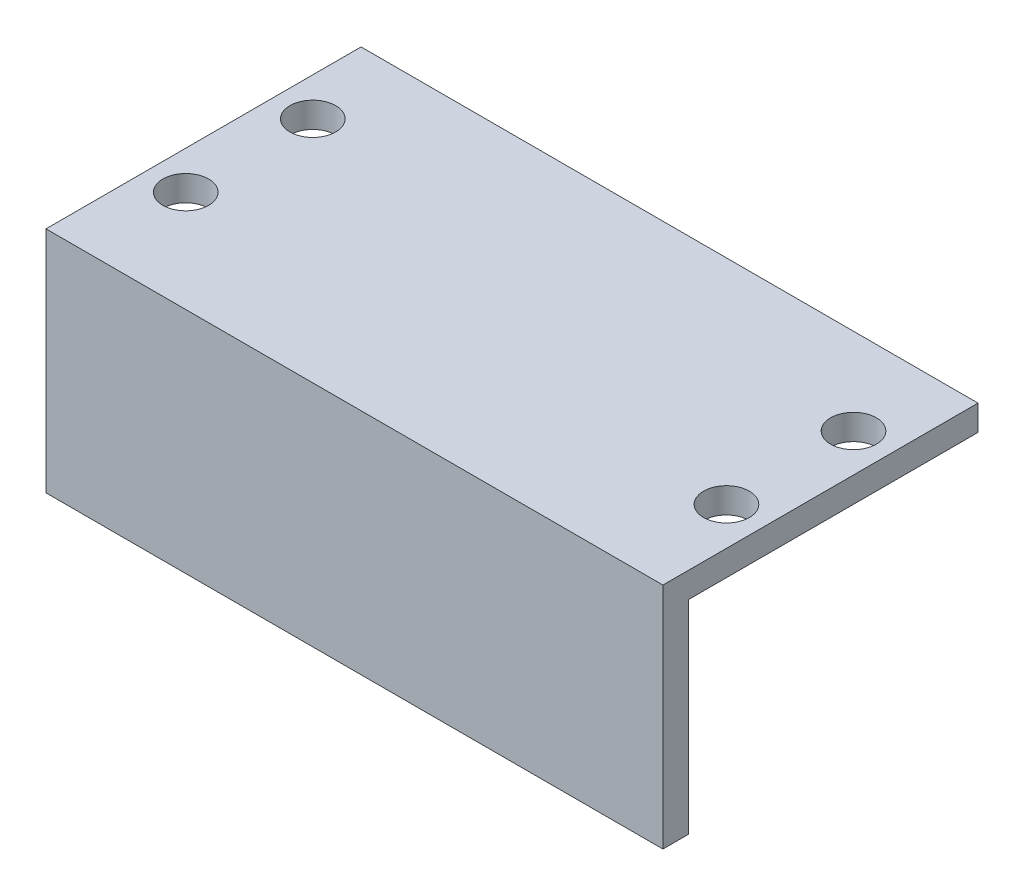
ISO-10303-21;
HEADER;
FILE_DESCRIPTION(('STEP AP214'),'2;1');
FILE_NAME('part.step','',(''),(''),'','','');
FILE_SCHEMA(('AUTOMOTIVE_DESIGN { 1 0 10303 214 1 1 1 1 }'));
ENDSEC;
DATA;
#1=APPLICATION_CONTEXT('core data for automotive mechanical design processes');
#2=APPLICATION_PROTOCOL_DEFINITION('international standard','automotive_design',2000,#1);
#3=PRODUCT_CONTEXT('',#1,'mechanical');
#4=PRODUCT('Part','Part','',(#3));
#5=PRODUCT_RELATED_PRODUCT_CATEGORY('part','',(#4));
#6=PRODUCT_DEFINITION_FORMATION('','',#4);
#7=PRODUCT_DEFINITION_CONTEXT('part definition',#1,'design');
#8=PRODUCT_DEFINITION('design','',#6,#7);
#9=PRODUCT_DEFINITION_SHAPE('','',#8);
#10=(LENGTH_UNIT() NAMED_UNIT(*) SI_UNIT(.MILLI.,.METRE.));
#11=(NAMED_UNIT(*) PLANE_ANGLE_UNIT() SI_UNIT($,.RADIAN.));
#12=(NAMED_UNIT(*) SI_UNIT($,.STERADIAN.) SOLID_ANGLE_UNIT());
#13=UNCERTAINTY_MEASURE_WITH_UNIT(LENGTH_MEASURE(1.E-05),#10,'distance_accuracy_value','');
#14=(GEOMETRIC_REPRESENTATION_CONTEXT(3) GLOBAL_UNCERTAINTY_ASSIGNED_CONTEXT((#13)) GLOBAL_UNIT_ASSIGNED_CONTEXT((#10,
#11,#12)) REPRESENTATION_CONTEXT('',''));
#15=CARTESIAN_POINT('',(0.,0.,0.));
#16=DIRECTION('',(0.,0.,1.));
#17=DIRECTION('',(1.,0.,0.));
#18=AXIS2_PLACEMENT_3D('',#15,#16,#17);
#19=CARTESIAN_POINT('',(24.28,1.,0.));
#20=DIRECTION('',(-1.,0.,0.));
#21=DIRECTION('',(0.,0.,1.));
#22=AXIS2_PLACEMENT_3D('',#19,#20,#21);
#23=PLANE('',#22);
#24=DIRECTION('',(0.,0.,-1.));
#25=VECTOR('',#24,1.);
#26=CARTESIAN_POINT('',(24.28,0.,0.));
#27=LINE('',#26,#25);
#28=CARTESIAN_POINT('',(24.28,0.,0.));
#29=VERTEX_POINT('',#28);
#30=CARTESIAN_POINT('',(24.28,0.,-11.4));
#31=VERTEX_POINT('',#30);
#32=EDGE_CURVE('E76',#29,#31,#27,.T.);
#33=ORIENTED_EDGE('',*,*,#32,.T.);
#34=DIRECTION('',(0.,-1.,0.));
#35=VECTOR('',#34,1.);
#36=CARTESIAN_POINT('',(24.28,1.,-11.4));
#37=LINE('',#36,#35);
#38=CARTESIAN_POINT('',(24.28,1.,-11.4));
#39=VERTEX_POINT('',#38);
#40=EDGE_CURVE('E11',#39,#31,#37,.T.);
#41=ORIENTED_EDGE('',*,*,#40,.F.);
#42=DIRECTION('',(0.,0.,-1.));
#43=VECTOR('',#42,1.);
#44=CARTESIAN_POINT('',(24.28,1.,0.));
#45=LINE('',#44,#43);
#46=CARTESIAN_POINT('',(24.28,1.,1.));
#47=VERTEX_POINT('',#46);
#48=EDGE_CURVE('E105',#47,#39,#45,.T.);
#49=ORIENTED_EDGE('',*,*,#48,.F.);
#50=DIRECTION('',(0.,1.,0.));
#51=VECTOR('',#50,1.);
#52=CARTESIAN_POINT('',(24.28,-8.,1.));
#53=LINE('',#52,#51);
#54=CARTESIAN_POINT('',(24.28,-8.,1.));
#55=VERTEX_POINT('',#54);
#56=EDGE_CURVE('E81',#55,#47,#53,.T.);
#57=ORIENTED_EDGE('',*,*,#56,.F.);
#58=DIRECTION('',(0.,0.,1.));
#59=VECTOR('',#58,1.);
#60=CARTESIAN_POINT('',(24.28,-8.,-1.68476343986867E-13));
#61=LINE('',#60,#59);
#62=CARTESIAN_POINT('',(24.28,-8.,0.));
#63=VERTEX_POINT('',#62);
#64=EDGE_CURVE('E177',#63,#55,#61,.T.);
#65=ORIENTED_EDGE('',*,*,#64,.F.);
#66=DIRECTION('',(0.,1.,0.));
#67=VECTOR('',#66,1.);
#68=CARTESIAN_POINT('',(24.28,-8.,0.));
#69=LINE('',#68,#67);
#70=EDGE_CURVE('E97',#63,#29,#69,.T.);
#71=ORIENTED_EDGE('',*,*,#70,.T.);
#72=EDGE_LOOP('',(#33,#41,#49,#57,#65,#71));
#73=FACE_BOUND('',#72,.T.);
#74=ADVANCED_FACE('F38',(#73),#23,.F.);
#75=CARTESIAN_POINT('',(0.,1.,-11.4));
#76=DIRECTION('',(0.,0.,-1.));
#77=DIRECTION('',(-1.,0.,0.));
#78=AXIS2_PLACEMENT_3D('',#75,#76,#77);
#79=PLANE('',#78);
#80=DIRECTION('',(1.,0.,0.));
#81=VECTOR('',#80,1.);
#82=CARTESIAN_POINT('',(0.,0.,-11.4));
#83=LINE('',#82,#81);
#84=CARTESIAN_POINT('',(0.,0.,-11.4));
#85=VERTEX_POINT('',#84);
#86=EDGE_CURVE('E90',#85,#31,#83,.T.);
#87=ORIENTED_EDGE('',*,*,#86,.F.);
#88=DIRECTION('',(0.,-1.,0.));
#89=VECTOR('',#88,1.);
#90=CARTESIAN_POINT('',(0.,1.,-11.4));
#91=LINE('',#90,#89);
#92=CARTESIAN_POINT('',(0.,1.,-11.4));
#93=VERTEX_POINT('',#92);
#94=EDGE_CURVE('E46',#93,#85,#91,.T.);
#95=ORIENTED_EDGE('',*,*,#94,.F.);
#96=DIRECTION('',(1.,0.,0.));
#97=VECTOR('',#96,1.);
#98=CARTESIAN_POINT('',(0.,1.,-11.4));
#99=LINE('',#98,#97);
#100=EDGE_CURVE('E107',#93,#39,#99,.T.);
#101=ORIENTED_EDGE('',*,*,#100,.T.);
#102=ORIENTED_EDGE('',*,*,#40,.T.);
#103=EDGE_LOOP('',(#87,#95,#101,#102));
#104=FACE_BOUND('',#103,.T.);
#105=ADVANCED_FACE('F152',(#104),#79,.T.);
#106=CARTESIAN_POINT('',(22.78,1.,-3.));
#107=DIRECTION('',(0.,-1.,0.));
#108=DIRECTION('',(0.,0.,-1.));
#109=AXIS2_PLACEMENT_3D('',#106,#107,#108);
#110=CYLINDRICAL_SURFACE('',#109,0.9);
#111=CARTESIAN_POINT('',(22.78,1.,-3.));
#112=DIRECTION('',(0.,1.,0.));
#113=DIRECTION('',(0.,0.,1.));
#114=AXIS2_PLACEMENT_3D('',#111,#112,#113);
#115=CIRCLE('',#114,0.9);
#116=CARTESIAN_POINT('',(22.78,1.,-2.1));
#117=VERTEX_POINT('',#116);
#118=EDGE_CURVE('E118',#117,#117,#115,.F.);
#119=ORIENTED_EDGE('',*,*,#118,.F.);
#120=EDGE_LOOP('',(#119));
#121=FACE_BOUND('',#120,.T.);
#122=CARTESIAN_POINT('',(22.78,0.,-3.));
#123=DIRECTION('',(0.,1.,0.));
#124=DIRECTION('',(0.,0.,1.));
#125=AXIS2_PLACEMENT_3D('',#122,#123,#124);
#126=CIRCLE('',#125,0.9);
#127=CARTESIAN_POINT('',(22.78,0.,-2.1));
#128=VERTEX_POINT('',#127);
#129=EDGE_CURVE('E131',#128,#128,#126,.F.);
#130=ORIENTED_EDGE('',*,*,#129,.T.);
#131=EDGE_LOOP('',(#130));
#132=FACE_BOUND('',#131,.T.);
#133=ADVANCED_FACE('F157',(#121,#132),#110,.F.);
#134=CARTESIAN_POINT('',(1.5,1.,-3.));
#135=DIRECTION('',(0.,-1.,0.));
#136=DIRECTION('',(0.,0.,-1.));
#137=AXIS2_PLACEMENT_3D('',#134,#135,#136);
#138=CYLINDRICAL_SURFACE('',#137,0.9);
#139=CARTESIAN_POINT('',(1.5,1.,-3.));
#140=DIRECTION('',(0.,1.,0.));
#141=DIRECTION('',(0.,0.,1.));
#142=AXIS2_PLACEMENT_3D('',#139,#140,#141);
#143=CIRCLE('',#142,0.9);
#144=CARTESIAN_POINT('',(1.5,1.,-2.1));
#145=VERTEX_POINT('',#144);
#146=EDGE_CURVE('E115',#145,#145,#143,.T.);
#147=ORIENTED_EDGE('',*,*,#146,.T.);
#148=EDGE_LOOP('',(#147));
#149=FACE_BOUND('',#148,.T.);
#150=CARTESIAN_POINT('',(1.5,0.,-3.));
#151=DIRECTION('',(0.,1.,0.));
#152=DIRECTION('',(0.,0.,1.));
#153=AXIS2_PLACEMENT_3D('',#150,#151,#152);
#154=CIRCLE('',#153,0.9);
#155=CARTESIAN_POINT('',(1.5,0.,-2.1));
#156=VERTEX_POINT('',#155);
#157=EDGE_CURVE('E128',#156,#156,#154,.T.);
#158=ORIENTED_EDGE('',*,*,#157,.F.);
#159=EDGE_LOOP('',(#158));
#160=FACE_BOUND('',#159,.T.);
#161=ADVANCED_FACE('F252',(#149,#160),#138,.F.);
#162=CARTESIAN_POINT('',(1.5,1.,-8.));
#163=DIRECTION('',(0.,-1.,0.));
#164=DIRECTION('',(0.,0.,-1.));
#165=AXIS2_PLACEMENT_3D('',#162,#163,#164);
#166=CYLINDRICAL_SURFACE('',#165,0.9);
#167=CARTESIAN_POINT('',(1.5,1.,-8.));
#168=DIRECTION('',(0.,1.,0.));
#169=DIRECTION('',(0.,0.,1.));
#170=AXIS2_PLACEMENT_3D('',#167,#168,#169);
#171=CIRCLE('',#170,0.9);
#172=CARTESIAN_POINT('',(1.5,1.,-7.1));
#173=VERTEX_POINT('',#172);
#174=EDGE_CURVE('E112',#173,#173,#171,.T.);
#175=ORIENTED_EDGE('',*,*,#174,.T.);
#176=EDGE_LOOP('',(#175));
#177=FACE_BOUND('',#176,.T.);
#178=CARTESIAN_POINT('',(1.5,0.,-8.));
#179=DIRECTION('',(0.,1.,0.));
#180=DIRECTION('',(0.,0.,1.));
#181=AXIS2_PLACEMENT_3D('',#178,#179,#180);
#182=CIRCLE('',#181,0.9);
#183=CARTESIAN_POINT('',(1.5,0.,-7.1));
#184=VERTEX_POINT('',#183);
#185=EDGE_CURVE('E89',#184,#184,#182,.T.);
#186=ORIENTED_EDGE('',*,*,#185,.F.);
#187=EDGE_LOOP('',(#186));
#188=FACE_BOUND('',#187,.T.);
#189=ADVANCED_FACE('F228',(#177,#188),#166,.F.);
#190=CARTESIAN_POINT('',(0.,1.,0.));
#191=DIRECTION('',(-1.,0.,0.));
#192=DIRECTION('',(0.,0.,1.));
#193=AXIS2_PLACEMENT_3D('',#190,#191,#192);
#194=PLANE('',#193);
#195=DIRECTION('',(0.,0.,-1.));
#196=VECTOR('',#195,1.);
#197=CARTESIAN_POINT('',(0.,0.,0.));
#198=LINE('',#197,#196);
#199=CARTESIAN_POINT('',(0.,0.,0.));
#200=VERTEX_POINT('',#199);
#201=EDGE_CURVE('E74',#200,#85,#198,.T.);
#202=ORIENTED_EDGE('',*,*,#201,.F.);
#203=DIRECTION('',(0.,1.,0.));
#204=VECTOR('',#203,1.);
#205=CARTESIAN_POINT('',(0.,-8.,0.));
#206=LINE('',#205,#204);
#207=CARTESIAN_POINT('',(0.,-8.,0.));
#208=VERTEX_POINT('',#207);
#209=EDGE_CURVE('E87',#208,#200,#206,.T.);
#210=ORIENTED_EDGE('',*,*,#209,.F.);
#211=DIRECTION('',(0.,0.,1.));
#212=VECTOR('',#211,1.);
#213=CARTESIAN_POINT('',(0.,-8.,0.));
#214=LINE('',#213,#212);
#215=CARTESIAN_POINT('',(0.,-8.,1.));
#216=VERTEX_POINT('',#215);
#217=EDGE_CURVE('E168',#208,#216,#214,.T.);
#218=ORIENTED_EDGE('',*,*,#217,.T.);
#219=DIRECTION('',(0.,1.,0.));
#220=VECTOR('',#219,1.);
#221=CARTESIAN_POINT('',(0.,-8.,1.));
#222=LINE('',#221,#220);
#223=CARTESIAN_POINT('',(0.,1.,1.));
#224=VERTEX_POINT('',#223);
#225=EDGE_CURVE('E96',#216,#224,#222,.T.);
#226=ORIENTED_EDGE('',*,*,#225,.T.);
#227=DIRECTION('',(0.,0.,-1.));
#228=VECTOR('',#227,1.);
#229=CARTESIAN_POINT('',(0.,1.,0.));
#230=LINE('',#229,#228);
#231=EDGE_CURVE('E110',#224,#93,#230,.T.);
#232=ORIENTED_EDGE('',*,*,#231,.T.);
#233=ORIENTED_EDGE('',*,*,#94,.T.);
#234=EDGE_LOOP('',(#202,#210,#218,#226,#232,#233));
#235=FACE_BOUND('',#234,.T.);
#236=ADVANCED_FACE('F84',(#235),#194,.T.);
#237=CARTESIAN_POINT('',(22.78,1.,-8.));
#238=DIRECTION('',(0.,-1.,0.));
#239=DIRECTION('',(0.,0.,-1.));
#240=AXIS2_PLACEMENT_3D('',#237,#238,#239);
#241=CYLINDRICAL_SURFACE('',#240,0.900000000000004);
#242=CARTESIAN_POINT('',(22.78,1.,-8.));
#243=DIRECTION('',(0.,1.,0.));
#244=DIRECTION('',(0.,0.,1.));
#245=AXIS2_PLACEMENT_3D('',#242,#243,#244);
#246=CIRCLE('',#245,0.900000000000004);
#247=CARTESIAN_POINT('',(22.78,1.,-7.1));
#248=VERTEX_POINT('',#247);
#249=EDGE_CURVE('E121',#248,#248,#246,.F.);
#250=ORIENTED_EDGE('',*,*,#249,.F.);
#251=EDGE_LOOP('',(#250));
#252=FACE_BOUND('',#251,.T.);
#253=CARTESIAN_POINT('',(22.78,0.,-8.));
#254=DIRECTION('',(0.,1.,0.));
#255=DIRECTION('',(0.,0.,1.));
#256=AXIS2_PLACEMENT_3D('',#253,#254,#255);
#257=CIRCLE('',#256,0.900000000000004);
#258=CARTESIAN_POINT('',(22.78,0.,-7.1));
#259=VERTEX_POINT('',#258);
#260=EDGE_CURVE('E108',#259,#259,#257,.F.);
#261=ORIENTED_EDGE('',*,*,#260,.T.);
#262=EDGE_LOOP('',(#261));
#263=FACE_BOUND('',#262,.T.);
#264=ADVANCED_FACE('F137',(#252,#263),#241,.F.);
#265=CARTESIAN_POINT('',(0.,1.,0.));
#266=DIRECTION('',(0.,1.,0.));
#267=DIRECTION('',(0.,0.,1.));
#268=AXIS2_PLACEMENT_3D('',#265,#266,#267);
#269=PLANE('',#268);
#270=ORIENTED_EDGE('',*,*,#231,.F.);
#271=DIRECTION('',(1.,0.,0.));
#272=VECTOR('',#271,1.);
#273=CARTESIAN_POINT('',(0.,1.,1.));
#274=LINE('',#273,#272);
#275=EDGE_CURVE('E175',#224,#47,#274,.T.);
#276=ORIENTED_EDGE('',*,*,#275,.T.);
#277=ORIENTED_EDGE('',*,*,#48,.T.);
#278=ORIENTED_EDGE('',*,*,#100,.F.);
#279=EDGE_LOOP('',(#270,#276,#277,#278));
#280=FACE_BOUND('',#279,.T.);
#281=ORIENTED_EDGE('',*,*,#174,.F.);
#282=EDGE_LOOP('',(#281));
#283=FACE_BOUND('',#282,.T.);
#284=ORIENTED_EDGE('',*,*,#146,.F.);
#285=EDGE_LOOP('',(#284));
#286=FACE_BOUND('',#285,.T.);
#287=ORIENTED_EDGE('',*,*,#118,.T.);
#288=EDGE_LOOP('',(#287));
#289=FACE_BOUND('',#288,.T.);
#290=ORIENTED_EDGE('',*,*,#249,.T.);
#291=EDGE_LOOP('',(#290));
#292=FACE_BOUND('',#291,.T.);
#293=ADVANCED_FACE('F140',(#280,#283,#286,#289,#292),#269,.T.);
#294=CARTESIAN_POINT('',(0.,0.,0.));
#295=DIRECTION('',(0.,1.,0.));
#296=DIRECTION('',(0.,0.,1.));
#297=AXIS2_PLACEMENT_3D('',#294,#295,#296);
#298=PLANE('',#297);
#299=DIRECTION('',(1.,0.,0.));
#300=VECTOR('',#299,1.);
#301=CARTESIAN_POINT('',(0.,0.,0.));
#302=LINE('',#301,#300);
#303=EDGE_CURVE('E70',#200,#29,#302,.T.);
#304=ORIENTED_EDGE('',*,*,#303,.F.);
#305=ORIENTED_EDGE('',*,*,#201,.T.);
#306=ORIENTED_EDGE('',*,*,#86,.T.);
#307=ORIENTED_EDGE('',*,*,#32,.F.);
#308=EDGE_LOOP('',(#304,#305,#306,#307));
#309=FACE_BOUND('',#308,.T.);
#310=ORIENTED_EDGE('',*,*,#185,.T.);
#311=EDGE_LOOP('',(#310));
#312=FACE_BOUND('',#311,.T.);
#313=ORIENTED_EDGE('',*,*,#157,.T.);
#314=EDGE_LOOP('',(#313));
#315=FACE_BOUND('',#314,.T.);
#316=ORIENTED_EDGE('',*,*,#129,.F.);
#317=EDGE_LOOP('',(#316));
#318=FACE_BOUND('',#317,.T.);
#319=ORIENTED_EDGE('',*,*,#260,.F.);
#320=EDGE_LOOP('',(#319));
#321=FACE_BOUND('',#320,.T.);
#322=ADVANCED_FACE('F71',(#309,#312,#315,#318,#321),#298,.F.);
#323=CARTESIAN_POINT('',(0.,-8.,0.));
#324=DIRECTION('',(0.,0.,1.));
#325=DIRECTION('',(1.,0.,0.));
#326=AXIS2_PLACEMENT_3D('',#323,#324,#325);
#327=PLANE('',#326);
#328=ORIENTED_EDGE('',*,*,#209,.T.);
#329=ORIENTED_EDGE('',*,*,#303,.T.);
#330=ORIENTED_EDGE('',*,*,#70,.F.);
#331=DIRECTION('',(1.,0.,0.));
#332=VECTOR('',#331,1.);
#333=CARTESIAN_POINT('',(0.,-8.,0.));
#334=LINE('',#333,#332);
#335=EDGE_CURVE('E94',#208,#63,#334,.T.);
#336=ORIENTED_EDGE('',*,*,#335,.F.);
#337=EDGE_LOOP('',(#328,#329,#330,#336));
#338=FACE_BOUND('',#337,.T.);
#339=ADVANCED_FACE('F92',(#338),#327,.F.);
#340=CARTESIAN_POINT('',(0.,-8.,1.));
#341=DIRECTION('',(0.,0.,1.));
#342=DIRECTION('',(1.,0.,0.));
#343=AXIS2_PLACEMENT_3D('',#340,#341,#342);
#344=PLANE('',#343);
#345=ORIENTED_EDGE('',*,*,#56,.T.);
#346=ORIENTED_EDGE('',*,*,#275,.F.);
#347=ORIENTED_EDGE('',*,*,#225,.F.);
#348=DIRECTION('',(1.,0.,0.));
#349=VECTOR('',#348,1.);
#350=CARTESIAN_POINT('',(0.,-8.,1.));
#351=LINE('',#350,#349);
#352=EDGE_CURVE('E101',#216,#55,#351,.T.);
#353=ORIENTED_EDGE('',*,*,#352,.T.);
#354=EDGE_LOOP('',(#345,#346,#347,#353));
#355=FACE_BOUND('',#354,.T.);
#356=ADVANCED_FACE('F146',(#355),#344,.T.);
#357=CARTESIAN_POINT('',(0.,-8.,0.));
#358=DIRECTION('',(0.,1.,0.));
#359=DIRECTION('',(0.,0.,1.));
#360=AXIS2_PLACEMENT_3D('',#357,#358,#359);
#361=PLANE('',#360);
#362=ORIENTED_EDGE('',*,*,#64,.T.);
#363=ORIENTED_EDGE('',*,*,#352,.F.);
#364=ORIENTED_EDGE('',*,*,#217,.F.);
#365=ORIENTED_EDGE('',*,*,#335,.T.);
#366=EDGE_LOOP('',(#362,#363,#364,#365));
#367=FACE_BOUND('',#366,.T.);
#368=ADVANCED_FACE('F187',(#367),#361,.F.);
#369=CLOSED_SHELL('',(#74,#105,#133,#161,#189,#236,#264,#293,#322,#339,#356,#368));
#370=MANIFOLD_SOLID_BREP('B2',#369);
#371=ADVANCED_BREP_SHAPE_REPRESENTATION('',(#18,#370),#14);
#372=SHAPE_DEFINITION_REPRESENTATION(#9,#371);
ENDSEC;
END-ISO-10303-21;
